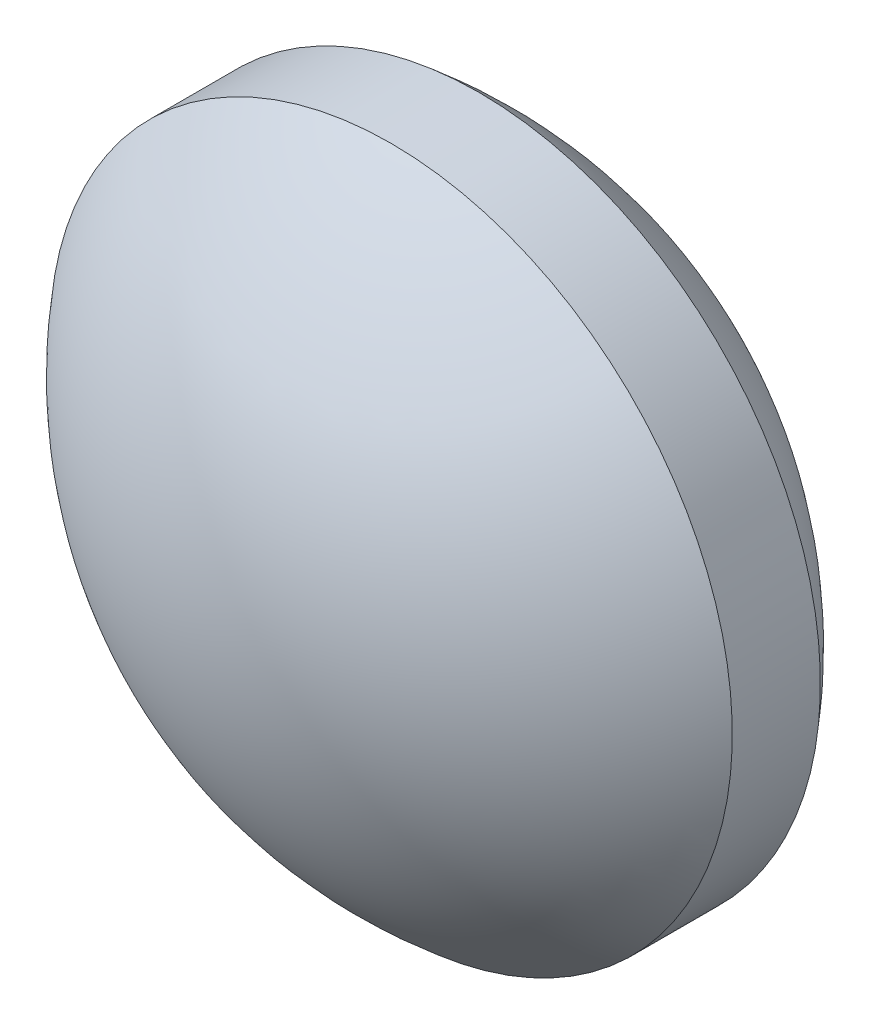
ISO-10303-21;
HEADER;
FILE_DESCRIPTION(('STEP AP214'),'2;1');
FILE_NAME('part.step','',(''),(''),'','','');
FILE_SCHEMA(('AUTOMOTIVE_DESIGN { 1 0 10303 214 1 1 1 1 }'));
ENDSEC;
DATA;
#1=APPLICATION_CONTEXT('core data for automotive mechanical design processes');
#2=APPLICATION_PROTOCOL_DEFINITION('international standard','automotive_design',2000,#1);
#3=PRODUCT_CONTEXT('',#1,'mechanical');
#4=PRODUCT('Part','Part','',(#3));
#5=PRODUCT_RELATED_PRODUCT_CATEGORY('part','',(#4));
#6=PRODUCT_DEFINITION_FORMATION('','',#4);
#7=PRODUCT_DEFINITION_CONTEXT('part definition',#1,'design');
#8=PRODUCT_DEFINITION('design','',#6,#7);
#9=PRODUCT_DEFINITION_SHAPE('','',#8);
#10=(LENGTH_UNIT() NAMED_UNIT(*) SI_UNIT(.MILLI.,.METRE.));
#11=(NAMED_UNIT(*) PLANE_ANGLE_UNIT() SI_UNIT($,.RADIAN.));
#12=(NAMED_UNIT(*) SI_UNIT($,.STERADIAN.) SOLID_ANGLE_UNIT());
#13=UNCERTAINTY_MEASURE_WITH_UNIT(LENGTH_MEASURE(1.E-05),#10,'distance_accuracy_value','');
#14=(GEOMETRIC_REPRESENTATION_CONTEXT(3) GLOBAL_UNCERTAINTY_ASSIGNED_CONTEXT((#13)) GLOBAL_UNIT_ASSIGNED_CONTEXT((#10,
#11,#12)) REPRESENTATION_CONTEXT('',''));
#15=CARTESIAN_POINT('',(0.,0.,0.));
#16=DIRECTION('',(0.,0.,1.));
#17=DIRECTION('',(1.,0.,0.));
#18=AXIS2_PLACEMENT_3D('',#15,#16,#17);
#19=CARTESIAN_POINT('',(0.,0.,2.65980616494114));
#20=DIRECTION('',(0.,0.,-1.));
#21=DIRECTION('',(0.,-1.,0.));
#22=AXIS2_PLACEMENT_3D('',#19,#20,#21);
#23=SPHERICAL_SURFACE('',#22,5.);
#24=CARTESIAN_POINT('',(0.,0.,-0.5));
#25=DIRECTION('',(0.,0.,-1.));
#26=DIRECTION('',(0.,1.,0.));
#27=AXIS2_PLACEMENT_3D('',#24,#25,#26);
#28=CIRCLE('',#27,3.875);
#29=CARTESIAN_POINT('',(0.,3.875,-0.5));
#30=VERTEX_POINT('',#29);
#31=EDGE_CURVE('E10',#30,#30,#28,.T.);
#32=ORIENTED_EDGE('',*,*,#31,.T.);
#33=EDGE_LOOP('',(#32));
#34=FACE_BOUND('',#33,.T.);
#35=ADVANCED_FACE('F42',(#34),#23,.T.);
#36=CARTESIAN_POINT('',(0.,0.,0.));
#37=DIRECTION('',(0.,0.,-1.));
#38=DIRECTION('',(0.,1.,0.));
#39=AXIS2_PLACEMENT_3D('',#36,#37,#38);
#40=CYLINDRICAL_SURFACE('',#39,3.875);
#41=ORIENTED_EDGE('',*,*,#31,.F.);
#42=EDGE_LOOP('',(#41));
#43=FACE_BOUND('',#42,.T.);
#44=CARTESIAN_POINT('',(0.,0.,0.5));
#45=DIRECTION('',(0.,0.,-1.));
#46=DIRECTION('',(0.,1.,0.));
#47=AXIS2_PLACEMENT_3D('',#44,#45,#46);
#48=CIRCLE('',#47,3.875);
#49=CARTESIAN_POINT('',(0.,3.875,0.5));
#50=VERTEX_POINT('',#49);
#51=EDGE_CURVE('E49',#50,#50,#48,.T.);
#52=ORIENTED_EDGE('',*,*,#51,.T.);
#53=EDGE_LOOP('',(#52));
#54=FACE_BOUND('',#53,.T.);
#55=ADVANCED_FACE('F56',(#43,#54),#40,.T.);
#56=CARTESIAN_POINT('',(0.,0.,-2.65980616494114));
#57=DIRECTION('',(0.,0.,-1.));
#58=DIRECTION('',(0.,1.,0.));
#59=AXIS2_PLACEMENT_3D('',#56,#57,#58);
#60=SPHERICAL_SURFACE('',#59,5.);
#61=ORIENTED_EDGE('',*,*,#51,.F.);
#62=EDGE_LOOP('',(#61));
#63=FACE_BOUND('',#62,.T.);
#64=ADVANCED_FACE('F58',(#63),#60,.T.);
#65=CLOSED_SHELL('',(#35,#55,#64));
#66=MANIFOLD_SOLID_BREP('B2',#65);
#67=ADVANCED_BREP_SHAPE_REPRESENTATION('',(#18,#66),#14);
#68=SHAPE_DEFINITION_REPRESENTATION(#9,#67);
ENDSEC;
END-ISO-10303-21;
